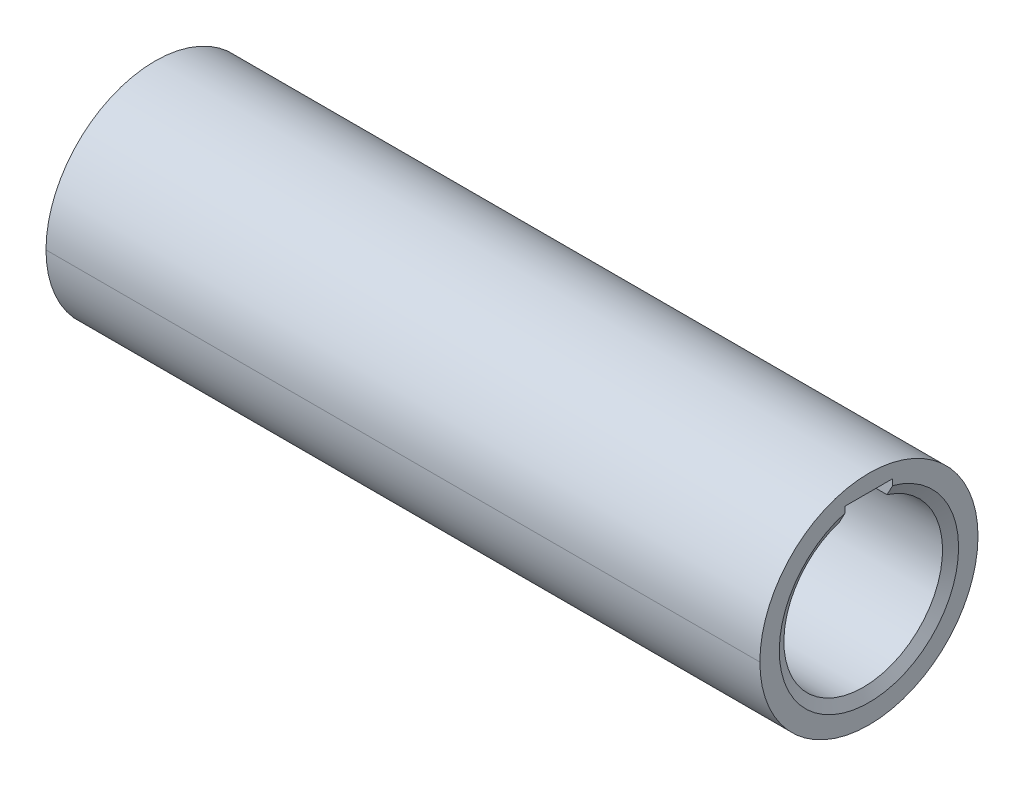
ISO-10303-21;
HEADER;
FILE_DESCRIPTION(('STEP AP214'),'2;1');
FILE_NAME('part.step','',(''),(''),'','','');
FILE_SCHEMA(('AUTOMOTIVE_DESIGN { 1 0 10303 214 1 1 1 1 }'));
ENDSEC;
DATA;
#1=APPLICATION_CONTEXT('core data for automotive mechanical design processes');
#2=APPLICATION_PROTOCOL_DEFINITION('international standard','automotive_design',2000,#1);
#3=PRODUCT_CONTEXT('',#1,'mechanical');
#4=PRODUCT('Part','Part','',(#3));
#5=PRODUCT_RELATED_PRODUCT_CATEGORY('part','',(#4));
#6=PRODUCT_DEFINITION_FORMATION('','',#4);
#7=PRODUCT_DEFINITION_CONTEXT('part definition',#1,'design');
#8=PRODUCT_DEFINITION('design','',#6,#7);
#9=PRODUCT_DEFINITION_SHAPE('','',#8);
#10=(LENGTH_UNIT() NAMED_UNIT(*) SI_UNIT(.MILLI.,.METRE.));
#11=(NAMED_UNIT(*) PLANE_ANGLE_UNIT() SI_UNIT($,.RADIAN.));
#12=(NAMED_UNIT(*) SI_UNIT($,.STERADIAN.) SOLID_ANGLE_UNIT());
#13=UNCERTAINTY_MEASURE_WITH_UNIT(LENGTH_MEASURE(1.E-05),#10,'distance_accuracy_value','');
#14=(GEOMETRIC_REPRESENTATION_CONTEXT(3) GLOBAL_UNCERTAINTY_ASSIGNED_CONTEXT((#13)) GLOBAL_UNIT_ASSIGNED_CONTEXT((#10,
#11,#12)) REPRESENTATION_CONTEXT('',''));
#15=CARTESIAN_POINT('',(0.,0.,0.));
#16=DIRECTION('',(0.,0.,1.));
#17=DIRECTION('',(1.,0.,0.));
#18=AXIS2_PLACEMENT_3D('',#15,#16,#17);
#19=CARTESIAN_POINT('',(-90.,27.5,0.));
#20=DIRECTION('',(-1.,0.,0.));
#21=DIRECTION('',(0.,0.,1.));
#22=AXIS2_PLACEMENT_3D('',#19,#20,#21);
#23=PLANE('',#22);
#24=DIRECTION('',(0.,0.,1.));
#25=VECTOR('',#24,1.);
#26=CARTESIAN_POINT('',(-90.,23.3,0.));
#27=LINE('',#26,#25);
#28=CARTESIAN_POINT('',(-90.,23.3,-6.));
#29=VERTEX_POINT('',#28);
#30=CARTESIAN_POINT('',(-90.,23.3,6.));
#31=VERTEX_POINT('',#30);
#32=EDGE_CURVE('E11',#29,#31,#27,.T.);
#33=ORIENTED_EDGE('',*,*,#32,.T.);
#34=DIRECTION('',(0.,-1.,0.));
#35=VECTOR('',#34,1.);
#36=CARTESIAN_POINT('',(-90.,27.5,6.));
#37=LINE('',#36,#35);
#38=CARTESIAN_POINT('',(-90.,21.7923495675487,6.));
#39=VERTEX_POINT('',#38);
#40=EDGE_CURVE('E25',#31,#39,#37,.T.);
#41=ORIENTED_EDGE('',*,*,#40,.T.);
#42=CARTESIAN_POINT('',(-90.,0.,0.));
#43=DIRECTION('',(1.,0.,0.));
#44=DIRECTION('',(0.,0.,-1.));
#45=AXIS2_PLACEMENT_3D('',#42,#43,#44);
#46=CIRCLE('',#45,22.603240910857);
#47=CARTESIAN_POINT('',(-90.,21.7923495675487,-6.));
#48=VERTEX_POINT('',#47);
#49=EDGE_CURVE('E104',#39,#48,#46,.T.);
#50=ORIENTED_EDGE('',*,*,#49,.T.);
#51=DIRECTION('',(0.,1.,0.));
#52=VECTOR('',#51,1.);
#53=CARTESIAN_POINT('',(-90.,27.5,-6.));
#54=LINE('',#53,#52);
#55=EDGE_CURVE('E224',#48,#29,#54,.T.);
#56=ORIENTED_EDGE('',*,*,#55,.T.);
#57=EDGE_LOOP('',(#33,#41,#50,#56));
#58=FACE_BOUND('',#57,.T.);
#59=CARTESIAN_POINT('',(-90.,0.,0.));
#60=DIRECTION('',(1.,0.,0.));
#61=DIRECTION('',(0.,0.,-1.));
#62=AXIS2_PLACEMENT_3D('',#59,#60,#61);
#63=CIRCLE('',#62,27.5);
#64=CARTESIAN_POINT('',(-90.,0.,27.5));
#65=VERTEX_POINT('',#64);
#66=CARTESIAN_POINT('',(-90.,0.,-27.5));
#67=VERTEX_POINT('',#66);
#68=EDGE_CURVE('E219',#65,#67,#63,.T.);
#69=ORIENTED_EDGE('',*,*,#68,.F.);
#70=CARTESIAN_POINT('',(-90.,0.,0.));
#71=DIRECTION('',(1.,0.,0.));
#72=DIRECTION('',(0.,0.,-1.));
#73=AXIS2_PLACEMENT_3D('',#70,#71,#72);
#74=CIRCLE('',#73,27.5);
#75=EDGE_CURVE('E214',#67,#65,#74,.T.);
#76=ORIENTED_EDGE('',*,*,#75,.F.);
#77=EDGE_LOOP('',(#69,#76));
#78=FACE_BOUND('',#77,.T.);
#79=ADVANCED_FACE('F17',(#58,#78),#23,.T.);
#80=CARTESIAN_POINT('',(90.,0.,0.));
#81=DIRECTION('',(1.,0.,0.));
#82=DIRECTION('',(0.,-1.,0.));
#83=AXIS2_PLACEMENT_3D('',#80,#81,#82);
#84=CYLINDRICAL_SURFACE('',#83,27.5);
#85=DIRECTION('',(1.,0.,0.));
#86=VECTOR('',#85,1.);
#87=CARTESIAN_POINT('',(-90.,0.,27.5));
#88=LINE('',#87,#86);
#89=CARTESIAN_POINT('',(90.,0.,27.5));
#90=VERTEX_POINT('',#89);
#91=EDGE_CURVE('E210',#65,#90,#88,.T.);
#92=ORIENTED_EDGE('',*,*,#91,.T.);
#93=CARTESIAN_POINT('',(90.,0.,0.));
#94=DIRECTION('',(1.,0.,0.));
#95=DIRECTION('',(0.,0.,-1.));
#96=AXIS2_PLACEMENT_3D('',#93,#94,#95);
#97=CIRCLE('',#96,27.5);
#98=CARTESIAN_POINT('',(90.,0.,-27.5));
#99=VERTEX_POINT('',#98);
#100=EDGE_CURVE('E205',#99,#90,#97,.T.);
#101=ORIENTED_EDGE('',*,*,#100,.F.);
#102=DIRECTION('',(1.,0.,0.));
#103=VECTOR('',#102,1.);
#104=CARTESIAN_POINT('',(-90.,0.,-27.5));
#105=LINE('',#104,#103);
#106=EDGE_CURVE('E200',#67,#99,#105,.T.);
#107=ORIENTED_EDGE('',*,*,#106,.F.);
#108=ORIENTED_EDGE('',*,*,#75,.T.);
#109=EDGE_LOOP('',(#92,#101,#107,#108));
#110=FACE_BOUND('',#109,.T.);
#111=ADVANCED_FACE('F279',(#110),#84,.T.);
#112=CARTESIAN_POINT('',(90.,0.,0.));
#113=DIRECTION('',(1.,0.,0.));
#114=DIRECTION('',(0.,1.,0.));
#115=AXIS2_PLACEMENT_3D('',#112,#113,#114);
#116=CYLINDRICAL_SURFACE('',#115,27.5);
#117=ORIENTED_EDGE('',*,*,#91,.F.);
#118=ORIENTED_EDGE('',*,*,#68,.T.);
#119=ORIENTED_EDGE('',*,*,#106,.T.);
#120=CARTESIAN_POINT('',(90.,0.,0.));
#121=DIRECTION('',(1.,0.,0.));
#122=DIRECTION('',(0.,0.,-1.));
#123=AXIS2_PLACEMENT_3D('',#120,#121,#122);
#124=CIRCLE('',#123,27.5);
#125=EDGE_CURVE('E195',#90,#99,#124,.T.);
#126=ORIENTED_EDGE('',*,*,#125,.F.);
#127=EDGE_LOOP('',(#117,#118,#119,#126));
#128=FACE_BOUND('',#127,.T.);
#129=ADVANCED_FACE('F283',(#128),#116,.T.);
#130=CARTESIAN_POINT('',(90.,22.603240910857,0.));
#131=DIRECTION('',(1.,0.,0.));
#132=DIRECTION('',(0.,0.,-1.));
#133=AXIS2_PLACEMENT_3D('',#130,#131,#132);
#134=PLANE('',#133);
#135=ORIENTED_EDGE('',*,*,#100,.T.);
#136=ORIENTED_EDGE('',*,*,#125,.T.);
#137=EDGE_LOOP('',(#135,#136));
#138=FACE_BOUND('',#137,.T.);
#139=CARTESIAN_POINT('',(90.,0.,0.));
#140=DIRECTION('',(1.,0.,0.));
#141=DIRECTION('',(0.,0.,-1.));
#142=AXIS2_PLACEMENT_3D('',#139,#140,#141);
#143=CIRCLE('',#142,22.603240910857);
#144=CARTESIAN_POINT('',(90.,21.7923495675487,6.));
#145=VERTEX_POINT('',#144);
#146=CARTESIAN_POINT('',(90.,21.7923495675487,-6.));
#147=VERTEX_POINT('',#146);
#148=EDGE_CURVE('E190',#145,#147,#143,.T.);
#149=ORIENTED_EDGE('',*,*,#148,.F.);
#150=DIRECTION('',(0.,1.,0.));
#151=VECTOR('',#150,1.);
#152=CARTESIAN_POINT('',(90.,22.603240910857,6.));
#153=LINE('',#152,#151);
#154=CARTESIAN_POINT('',(90.,23.3,6.));
#155=VERTEX_POINT('',#154);
#156=EDGE_CURVE('E186',#145,#155,#153,.T.);
#157=ORIENTED_EDGE('',*,*,#156,.T.);
#158=DIRECTION('',(0.,0.,-1.));
#159=VECTOR('',#158,1.);
#160=CARTESIAN_POINT('',(90.,23.3,0.));
#161=LINE('',#160,#159);
#162=CARTESIAN_POINT('',(90.,23.3,-6.));
#163=VERTEX_POINT('',#162);
#164=EDGE_CURVE('E182',#155,#163,#161,.T.);
#165=ORIENTED_EDGE('',*,*,#164,.T.);
#166=DIRECTION('',(0.,-1.,0.));
#167=VECTOR('',#166,1.);
#168=CARTESIAN_POINT('',(90.,22.603240910857,-6.));
#169=LINE('',#168,#167);
#170=EDGE_CURVE('E180',#163,#147,#169,.T.);
#171=ORIENTED_EDGE('',*,*,#170,.T.);
#172=EDGE_LOOP('',(#149,#157,#165,#171));
#173=FACE_BOUND('',#172,.T.);
#174=ADVANCED_FACE('F162',(#138,#173),#134,.T.);
#175=CARTESIAN_POINT('',(180.,0.,-6.));
#176=DIRECTION('',(0.,0.,1.));
#177=DIRECTION('',(1.,0.,0.));
#178=AXIS2_PLACEMENT_3D('',#175,#176,#177);
#179=PLANE('',#178);
#180=CARTESIAN_POINT('',(-88.557,19.0787840283389,-6.));
#181=CARTESIAN_POINT('',(-88.5869237803009,19.135374558361,-5.99999999294082));
#182=CARTESIAN_POINT('',(-88.616856901472,19.1919601489492,-5.99999984548279));
#183=CARTESIAN_POINT('',(-88.6767547536291,19.3051469126602,-5.99999941661826));
#184=CARTESIAN_POINT('',(-88.7067194927594,19.3617480814731,-5.99999913515203));
#185=CARTESIAN_POINT('',(-88.7666762941106,19.4749588810276,-5.99999858530191));
#186=CARTESIAN_POINT('',(-88.796668361977,19.5315685087792,-5.99999831692219));
#187=CARTESIAN_POINT('',(-88.8566755363748,19.6447891091148,-5.99999788759342));
#188=CARTESIAN_POINT('',(-88.8866906461651,19.7014000799715,-5.99999772666448));
#189=CARTESIAN_POINT('',(-88.9467396192535,19.8146162546084,-5.99999756450688));
#190=CARTESIAN_POINT('',(-88.9767734835326,19.8712214578683,-5.99999756328743));
#191=CARTESIAN_POINT('',(-89.0368556803967,19.9844189905075,-5.99999772297779));
#192=CARTESIAN_POINT('',(-89.0669040117917,20.0410113205183,-5.99999788387599));
#193=CARTESIAN_POINT('',(-89.1270108579388,20.1541760049972,-5.9999983227411));
#194=CARTESIAN_POINT('',(-89.1570693694352,20.2107483611946,-5.9999986006845));
#195=CARTESIAN_POINT('',(-89.217192289223,20.3238660027121,-5.99999916185598));
#196=CARTESIAN_POINT('',(-89.2472566922968,20.3804112908054,-5.99999944508227));
#197=CARTESIAN_POINT('',(-89.3073872133315,20.4934678897643,-5.99999989576657));
#198=CARTESIAN_POINT('',(-89.3374533242634,20.5499792043683,-6.00000006327729));
#199=CARTESIAN_POINT('',(-89.3975943801303,20.6629822429393,-5.99999991776261));
#200=CARTESIAN_POINT('',(-89.4276693219838,20.7194739685463,-5.99999960483588));
#201=CARTESIAN_POINT('',(-89.4878342616897,20.8324502582187,-5.99999885257825));
#202=CARTESIAN_POINT('',(-89.5179242597158,20.8889348221915,-5.99999841324587));
#203=CARTESIAN_POINT('',(-89.5781188544962,21.0018966496482,-5.99999769734376));
#204=CARTESIAN_POINT('',(-89.6082234513456,21.0583739130814,-5.99999742077511));
#205=CARTESIAN_POINT('',(-89.6684467841641,21.1713210205182,-5.99999716024026));
#206=CARTESIAN_POINT('',(-89.6985655201565,21.2277908645095,-5.99999717627455));
#207=CARTESIAN_POINT('',(-89.7588166721576,21.3407230319634,-5.99999749306322));
#208=CARTESIAN_POINT('',(-89.788949088124,21.3971853554485,-5.99999779381673));
#209=CARTESIAN_POINT('',(-89.8492271412592,21.5101023980901,-5.99999854011409));
#210=CARTESIAN_POINT('',(-89.8793727783268,21.5665571173006,-5.99999898565684));
#211=CARTESIAN_POINT('',(-89.9396768131596,21.6794588854474,-5.99999970288026));
#212=CARTESIAN_POINT('',(-89.9698352107705,21.7359059344663,-5.99999997456298));
#213=CARTESIAN_POINT('',(-90.,21.7923495675487,-6.00000000000002));
#214=B_SPLINE_CURVE_WITH_KNOTS('',3,(#180,#181,#182,#183,#184,#185,#186,#187,#188,#189,#190,
#191,#192,#193,#194,#195,#196,#197,#198,#199,#200,#201,#202,#203,#204,#205,#206,#207,#208,#209,
#210,#211,#212,#213),.UNSPECIFIED.,.F.,.F.,(4,2,2,2,2,2,2,2,2,2,2,2,2,2,2,2,4),(0.,
0.192045010372916,0.384175694672082,0.576367176305219,0.76859458952102,0.960833080123725,
1.15305780612124,1.34524393831191,1.53736666081489,1.72940180461426,1.92139751773963,
2.11339549877543,2.3053947475912,2.49739431294542,2.68939329073334,2.88139082230675,
3.07338609287112),.UNSPECIFIED.);
#215=CARTESIAN_POINT('',(-88.557,19.0787840283389,-6.));
#216=VERTEX_POINT('',#215);
#217=EDGE_CURVE('E179',#216,#48,#214,.T.);
#218=ORIENTED_EDGE('',*,*,#217,.F.);
#219=DIRECTION('',(-1.,0.,0.));
#220=VECTOR('',#219,1.);
#221=CARTESIAN_POINT('',(90.,19.0787840283389,-6.));
#222=LINE('',#221,#220);
#223=CARTESIAN_POINT('',(88.557,19.0787840283389,-6.));
#224=VERTEX_POINT('',#223);
#225=EDGE_CURVE('E97',#224,#216,#222,.T.);
#226=ORIENTED_EDGE('',*,*,#225,.F.);
#227=CARTESIAN_POINT('',(90.,21.7923495675487,-5.99999999999999));
#228=CARTESIAN_POINT('',(89.9396425566164,21.6794102051152,-5.99999952033998));
#229=CARTESIAN_POINT('',(89.879310062078,21.5664575077226,-5.99999292834445));
#230=CARTESIAN_POINT('',(89.7586980192669,21.3405232886249,-5.99997469335035));
#231=CARTESIAN_POINT('',(89.6984184711993,21.2275417668103,-5.99996305033229));
#232=CARTESIAN_POINT('',(89.5779154370191,21.0015478682423,-5.99994188700558));
#233=CARTESIAN_POINT('',(89.5176919512802,20.8885354912897,-5.99993236671098));
#234=CARTESIAN_POINT('',(89.3973041272527,20.6624781652768,-5.99991924212223));
#235=CARTESIAN_POINT('',(89.3371397894042,20.5494332159821,-5.99991563787179));
#236=CARTESIAN_POINT('',(89.2168733559423,20.3233093407536,-5.9999156944917));
#237=CARTESIAN_POINT('',(89.1567712607052,20.2102304146195,-5.99991935540572));
#238=CARTESIAN_POINT('',(89.0366324020784,19.9840375263042,-5.99993255369478));
#239=CARTESIAN_POINT('',(88.9765956388404,19.8709235640424,-5.99994209108343));
#240=CARTESIAN_POINT('',(88.8565905470353,19.6446599051687,-5.99996323074081));
#241=CARTESIAN_POINT('',(88.7966222182034,19.5315102086972,-5.99997483300154));
#242=CARTESIAN_POINT('',(88.6767570522019,19.3051748067895,-5.99999298501345));
#243=CARTESIAN_POINT('',(88.6168602141281,19.1919891018322,-5.99999953482922));
#244=CARTESIAN_POINT('',(88.557,19.0787840283389,-5.99999999999998));
#245=B_SPLINE_CURVE_WITH_KNOTS('',3,(#227,#228,#229,#230,#231,#232,#233,#234,#235,#236,#237,
#238,#239,#240,#241,#242,#243,#244),.UNSPECIFIED.,.F.,.F.,(4,2,2,2,2,2,2,2,4),(0.,
0.384167781485086,0.768337045863056,1.15250885365662,1.53668349964035,1.92086045448789,
2.30503829911662,2.68921465269917,3.07338609529481),.UNSPECIFIED.);
#246=EDGE_CURVE('E145',#147,#224,#245,.T.);
#247=ORIENTED_EDGE('',*,*,#246,.F.);
#248=ORIENTED_EDGE('',*,*,#170,.F.);
#249=DIRECTION('',(-1.,0.,0.));
#250=VECTOR('',#249,1.);
#251=CARTESIAN_POINT('',(180.,23.3,-6.));
#252=LINE('',#251,#250);
#253=EDGE_CURVE('E140',#163,#29,#252,.T.);
#254=ORIENTED_EDGE('',*,*,#253,.T.);
#255=ORIENTED_EDGE('',*,*,#55,.F.);
#256=EDGE_LOOP('',(#218,#226,#247,#248,#254,#255));
#257=FACE_BOUND('',#256,.T.);
#258=ADVANCED_FACE('F153',(#257),#179,.T.);
#259=CARTESIAN_POINT('',(180.,23.3,-6.));
#260=DIRECTION('',(0.,-1.,0.));
#261=DIRECTION('',(0.,0.,-1.));
#262=AXIS2_PLACEMENT_3D('',#259,#260,#261);
#263=PLANE('',#262);
#264=ORIENTED_EDGE('',*,*,#253,.F.);
#265=ORIENTED_EDGE('',*,*,#164,.F.);
#266=DIRECTION('',(-1.,0.,0.));
#267=VECTOR('',#266,1.);
#268=CARTESIAN_POINT('',(180.,23.3,6.));
#269=LINE('',#268,#267);
#270=EDGE_CURVE('E138',#155,#31,#269,.T.);
#271=ORIENTED_EDGE('',*,*,#270,.T.);
#272=ORIENTED_EDGE('',*,*,#32,.F.);
#273=EDGE_LOOP('',(#264,#265,#271,#272));
#274=FACE_BOUND('',#273,.T.);
#275=ADVANCED_FACE('F122',(#274),#263,.T.);
#276=CARTESIAN_POINT('',(180.,23.3,6.));
#277=DIRECTION('',(0.,0.,-1.));
#278=DIRECTION('',(-1.,0.,0.));
#279=AXIS2_PLACEMENT_3D('',#276,#277,#278);
#280=PLANE('',#279);
#281=ORIENTED_EDGE('',*,*,#270,.F.);
#282=ORIENTED_EDGE('',*,*,#156,.F.);
#283=CARTESIAN_POINT('',(88.557,19.0787840283389,6.));
#284=CARTESIAN_POINT('',(88.5869237803009,19.135374558361,5.99999999294083));
#285=CARTESIAN_POINT('',(88.616856901472,19.1919601489492,5.9999998454828));
#286=CARTESIAN_POINT('',(88.6767547536291,19.3051469126602,5.99999941661827));
#287=CARTESIAN_POINT('',(88.7067194927594,19.3617480814731,5.99999913515204));
#288=CARTESIAN_POINT('',(88.7666762941105,19.4749588810276,5.99999858530191));
#289=CARTESIAN_POINT('',(88.796668361977,19.5315685087792,5.99999831692219));
#290=CARTESIAN_POINT('',(88.8566755363748,19.6447891091148,5.99999788759343));
#291=CARTESIAN_POINT('',(88.8866906461651,19.7014000799715,5.99999772666448));
#292=CARTESIAN_POINT('',(88.9467396192535,19.8146162546084,5.99999756450688));
#293=CARTESIAN_POINT('',(88.9767734835326,19.8712214578683,5.99999756328743));
#294=CARTESIAN_POINT('',(89.0368556803966,19.9844189905075,5.99999772297779));
#295=CARTESIAN_POINT('',(89.0669040117916,20.0410113205183,5.99999788387599));
#296=CARTESIAN_POINT('',(89.1270108579388,20.1541760049973,5.9999983227411));
#297=CARTESIAN_POINT('',(89.1570693694352,20.2107483611946,5.9999986006845));
#298=CARTESIAN_POINT('',(89.217192289223,20.3238660027121,5.99999916185597));
#299=CARTESIAN_POINT('',(89.2472566922968,20.3804112908055,5.99999944508226));
#300=CARTESIAN_POINT('',(89.3073872133315,20.4934678897643,5.99999989576657));
#301=CARTESIAN_POINT('',(89.3374533242634,20.5499792043683,6.00000006327729));
#302=CARTESIAN_POINT('',(89.3975943801302,20.6629822429393,5.99999991776261));
#303=CARTESIAN_POINT('',(89.4276693219837,20.7194739685463,5.99999960483587));
#304=CARTESIAN_POINT('',(89.4878342616897,20.8324502582187,5.99999885257824));
#305=CARTESIAN_POINT('',(89.5179242597158,20.8889348221915,5.99999841324586));
#306=CARTESIAN_POINT('',(89.5781188544962,21.0018966496482,5.99999769734375));
#307=CARTESIAN_POINT('',(89.6082234513456,21.0583739130814,5.9999974207751));
#308=CARTESIAN_POINT('',(89.6684467841641,21.1713210205182,5.99999716024026));
#309=CARTESIAN_POINT('',(89.6985655201565,21.2277908645095,5.99999717627454));
#310=CARTESIAN_POINT('',(89.7588166721575,21.3407230319634,5.99999749306321));
#311=CARTESIAN_POINT('',(89.788949088124,21.3971853554485,5.99999779381672));
#312=CARTESIAN_POINT('',(89.8492271412592,21.5101023980901,5.99999854011408));
#313=CARTESIAN_POINT('',(89.8793727783268,21.5665571173006,5.99999898565683));
#314=CARTESIAN_POINT('',(89.9396768131596,21.6794588854474,5.99999970288025));
#315=CARTESIAN_POINT('',(89.9698352107705,21.7359059344663,5.99999997456296));
#316=CARTESIAN_POINT('',(90.,21.7923495675487,6.));
#317=B_SPLINE_CURVE_WITH_KNOTS('',3,(#283,#284,#285,#286,#287,#288,#289,#290,#291,#292,#293,
#294,#295,#296,#297,#298,#299,#300,#301,#302,#303,#304,#305,#306,#307,#308,#309,#310,#311,#312,
#313,#314,#315,#316),.UNSPECIFIED.,.F.,.F.,(4,2,2,2,2,2,2,2,2,2,2,2,2,2,2,2,4),(0.,
0.19204501037291,0.384175694672078,0.576367176305212,0.768594589521013,0.960833080123718,
1.15305780612124,1.34524393831191,1.53736666081489,1.72940180461426,1.92139751773963,
2.11339549877542,2.3053947475912,2.49739431294542,2.68939329073334,2.88139082230674,
3.07338609287112),.UNSPECIFIED.);
#318=CARTESIAN_POINT('',(88.557,19.0787840283389,6.));
#319=VERTEX_POINT('',#318);
#320=EDGE_CURVE('E87',#319,#145,#317,.T.);
#321=ORIENTED_EDGE('',*,*,#320,.F.);
#322=DIRECTION('',(1.,0.,0.));
#323=VECTOR('',#322,1.);
#324=CARTESIAN_POINT('',(90.,19.0787840283389,6.));
#325=LINE('',#324,#323);
#326=CARTESIAN_POINT('',(-88.557,19.0787840283389,6.));
#327=VERTEX_POINT('',#326);
#328=EDGE_CURVE('E77',#327,#319,#325,.T.);
#329=ORIENTED_EDGE('',*,*,#328,.F.);
#330=CARTESIAN_POINT('',(-90.,21.7923495675487,5.99999999999999));
#331=CARTESIAN_POINT('',(-89.9396425566164,21.6794102051153,5.99999952033998));
#332=CARTESIAN_POINT('',(-89.879310062078,21.5664575077226,5.99999292834445));
#333=CARTESIAN_POINT('',(-89.7586980192669,21.3405232886249,5.99997469335035));
#334=CARTESIAN_POINT('',(-89.6984184711993,21.2275417668103,5.99996305033229));
#335=CARTESIAN_POINT('',(-89.5779154370191,21.0015478682423,5.99994188700558));
#336=CARTESIAN_POINT('',(-89.5176919512802,20.8885354912897,5.99993236671098));
#337=CARTESIAN_POINT('',(-89.3973041272527,20.6624781652768,5.99991924212224));
#338=CARTESIAN_POINT('',(-89.3371397894042,20.5494332159821,5.99991563787181));
#339=CARTESIAN_POINT('',(-89.2168733559424,20.3233093407535,5.99991569449172));
#340=CARTESIAN_POINT('',(-89.1567712607052,20.2102304146195,5.99991935540572));
#341=CARTESIAN_POINT('',(-89.0366324020785,19.9840375263042,5.99993255369478));
#342=CARTESIAN_POINT('',(-88.9765956388404,19.8709235640424,5.99994209108345));
#343=CARTESIAN_POINT('',(-88.8565905470353,19.6446599051687,5.99996323074085));
#344=CARTESIAN_POINT('',(-88.7966222182034,19.5315102086971,5.99997483300156));
#345=CARTESIAN_POINT('',(-88.6767570522019,19.3051748067895,5.99999298501345));
#346=CARTESIAN_POINT('',(-88.6168602141282,19.1919891018322,5.99999953482921));
#347=CARTESIAN_POINT('',(-88.557,19.0787840283389,5.99999999999999));
#348=B_SPLINE_CURVE_WITH_KNOTS('',3,(#330,#331,#332,#333,#334,#335,#336,#337,#338,#339,#340,
#341,#342,#343,#344,#345,#346,#347),.UNSPECIFIED.,.F.,.F.,(4,2,2,2,2,2,2,2,4),(0.,
0.384167781485086,0.768337045863059,1.15250885365662,1.53668349964036,1.92086045448789,
2.30503829911664,2.68921465269917,3.07338609529482),.UNSPECIFIED.);
#349=EDGE_CURVE('E82',#39,#327,#348,.T.);
#350=ORIENTED_EDGE('',*,*,#349,.F.);
#351=ORIENTED_EDGE('',*,*,#40,.F.);
#352=EDGE_LOOP('',(#281,#282,#321,#329,#350,#351));
#353=FACE_BOUND('',#352,.T.);
#354=ADVANCED_FACE('F80',(#353),#280,.T.);
#355=CARTESIAN_POINT('',(-90.,0.,0.));
#356=DIRECTION('',(-1.,0.,0.));
#357=DIRECTION('',(0.,1.,0.));
#358=AXIS2_PLACEMENT_3D('',#355,#356,#357);
#359=CONICAL_SURFACE('',#358,22.603240910857,1.0646508437166);
#360=ORIENTED_EDGE('',*,*,#49,.F.);
#361=ORIENTED_EDGE('',*,*,#349,.T.);
#362=CARTESIAN_POINT('',(-88.557,0.,0.));
#363=DIRECTION('',(1.,0.,0.));
#364=DIRECTION('',(0.,0.,-1.));
#365=AXIS2_PLACEMENT_3D('',#362,#363,#364);
#366=CIRCLE('',#365,20.);
#367=EDGE_CURVE('E95',#327,#216,#366,.T.);
#368=ORIENTED_EDGE('',*,*,#367,.T.);
#369=ORIENTED_EDGE('',*,*,#217,.T.);
#370=EDGE_LOOP('',(#360,#361,#368,#369));
#371=FACE_BOUND('',#370,.T.);
#372=ADVANCED_FACE('F103',(#371),#359,.F.);
#373=CARTESIAN_POINT('',(90.,0.,0.));
#374=DIRECTION('',(1.,0.,0.));
#375=DIRECTION('',(0.,1.,0.));
#376=AXIS2_PLACEMENT_3D('',#373,#374,#375);
#377=CYLINDRICAL_SURFACE('',#376,20.);
#378=ORIENTED_EDGE('',*,*,#367,.F.);
#379=ORIENTED_EDGE('',*,*,#328,.T.);
#380=CARTESIAN_POINT('',(88.557,0.,0.));
#381=DIRECTION('',(1.,0.,0.));
#382=DIRECTION('',(0.,0.,-1.));
#383=AXIS2_PLACEMENT_3D('',#380,#381,#382);
#384=CIRCLE('',#383,20.);
#385=EDGE_CURVE('E100',#319,#224,#384,.T.);
#386=ORIENTED_EDGE('',*,*,#385,.T.);
#387=ORIENTED_EDGE('',*,*,#225,.T.);
#388=EDGE_LOOP('',(#378,#379,#386,#387));
#389=FACE_BOUND('',#388,.T.);
#390=ADVANCED_FACE('F96',(#389),#377,.F.);
#391=CARTESIAN_POINT('',(88.557,0.,0.));
#392=DIRECTION('',(1.,0.,0.));
#393=DIRECTION('',(0.,1.,0.));
#394=AXIS2_PLACEMENT_3D('',#391,#392,#393);
#395=CONICAL_SURFACE('',#394,20.,1.0646508437166);
#396=ORIENTED_EDGE('',*,*,#385,.F.);
#397=ORIENTED_EDGE('',*,*,#320,.T.);
#398=ORIENTED_EDGE('',*,*,#148,.T.);
#399=ORIENTED_EDGE('',*,*,#246,.T.);
#400=EDGE_LOOP('',(#396,#397,#398,#399));
#401=FACE_BOUND('',#400,.T.);
#402=ADVANCED_FACE('F246',(#401),#395,.F.);
#403=CLOSED_SHELL('',(#79,#111,#129,#174,#258,#275,#354,#372,#390,#402));
#404=MANIFOLD_SOLID_BREP('B1',#403);
#405=ADVANCED_BREP_SHAPE_REPRESENTATION('',(#18,#404),#14);
#406=SHAPE_DEFINITION_REPRESENTATION(#9,#405);
ENDSEC;
END-ISO-10303-21;
